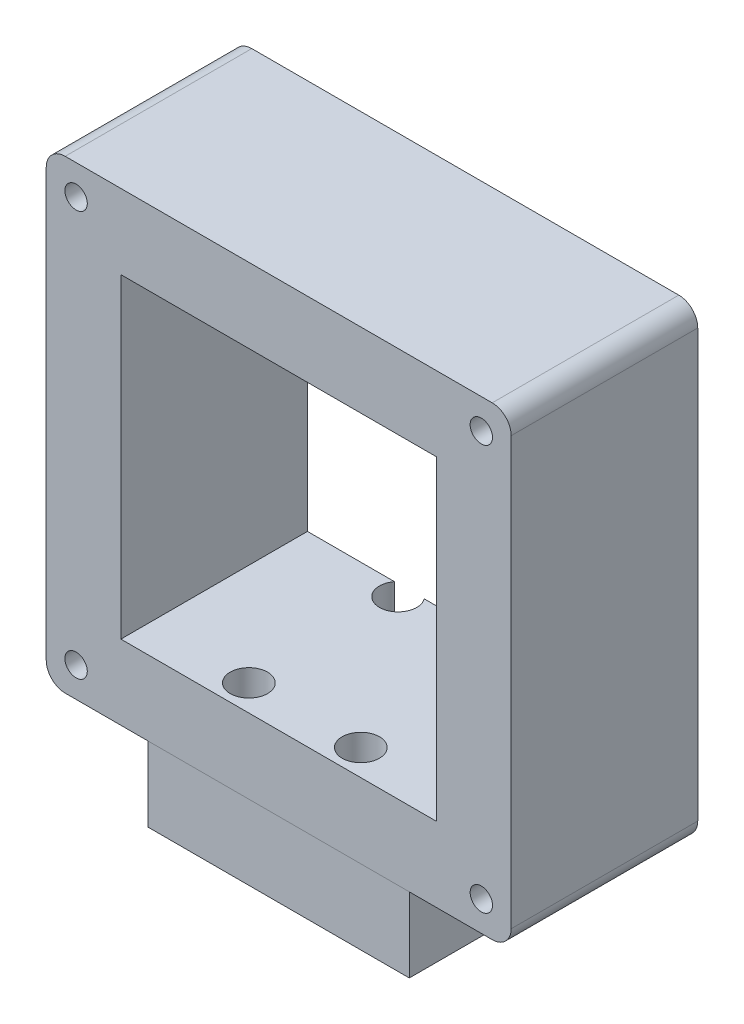
ISO-10303-21;
HEADER;
FILE_DESCRIPTION(('STEP AP214'),'2;1');
FILE_NAME('part.step','',(''),(''),'','','');
FILE_SCHEMA(('AUTOMOTIVE_DESIGN { 1 0 10303 214 1 1 1 1 }'));
ENDSEC;
DATA;
#1=APPLICATION_CONTEXT('core data for automotive mechanical design processes');
#2=APPLICATION_PROTOCOL_DEFINITION('international standard','automotive_design',2000,#1);
#3=PRODUCT_CONTEXT('',#1,'mechanical');
#4=PRODUCT('Part','Part','',(#3));
#5=PRODUCT_RELATED_PRODUCT_CATEGORY('part','',(#4));
#6=PRODUCT_DEFINITION_FORMATION('','',#4);
#7=PRODUCT_DEFINITION_CONTEXT('part definition',#1,'design');
#8=PRODUCT_DEFINITION('design','',#6,#7);
#9=PRODUCT_DEFINITION_SHAPE('','',#8);
#10=(LENGTH_UNIT() NAMED_UNIT(*) SI_UNIT(.MILLI.,.METRE.));
#11=(NAMED_UNIT(*) PLANE_ANGLE_UNIT() SI_UNIT($,.RADIAN.));
#12=(NAMED_UNIT(*) SI_UNIT($,.STERADIAN.) SOLID_ANGLE_UNIT());
#13=UNCERTAINTY_MEASURE_WITH_UNIT(LENGTH_MEASURE(1.E-05),#10,'distance_accuracy_value','');
#14=(GEOMETRIC_REPRESENTATION_CONTEXT(3) GLOBAL_UNCERTAINTY_ASSIGNED_CONTEXT((#13)) GLOBAL_UNIT_ASSIGNED_CONTEXT((#10,
#11,#12)) REPRESENTATION_CONTEXT('',''));
#15=CARTESIAN_POINT('',(0.,0.,0.));
#16=DIRECTION('',(0.,0.,1.));
#17=DIRECTION('',(1.,0.,0.));
#18=AXIS2_PLACEMENT_3D('',#15,#16,#17);
#19=CARTESIAN_POINT('',(0.,0.,-11.5));
#20=DIRECTION('',(0.,0.,-1.));
#21=DIRECTION('',(-1.,0.,0.));
#22=AXIS2_PLACEMENT_3D('',#19,#20,#21);
#23=PLANE('',#22);
#24=DIRECTION('',(0.,-1.,0.));
#25=VECTOR('',#24,1.);
#26=CARTESIAN_POINT('',(-5.50000003175,22.0710678118655,-11.5));
#27=LINE('',#26,#25);
#28=CARTESIAN_POINT('',(-5.50000003175,15.,-11.5));
#29=VERTEX_POINT('',#28);
#30=CARTESIAN_POINT('',(-5.50000003175,5.,-11.5));
#31=VERTEX_POINT('',#30);
#32=EDGE_CURVE('E341',#29,#31,#27,.T.);
#33=ORIENTED_EDGE('',*,*,#32,.F.);
#34=DIRECTION('',(1.,0.,0.));
#35=VECTOR('',#34,1.);
#36=CARTESIAN_POINT('',(-21.15,15.,-11.5));
#37=LINE('',#36,#35);
#38=CARTESIAN_POINT('',(5.50000003175,15.,-11.5));
#39=VERTEX_POINT('',#38);
#40=EDGE_CURVE('E198',#29,#39,#37,.T.);
#41=ORIENTED_EDGE('',*,*,#40,.T.);
#42=DIRECTION('',(0.,-1.,0.));
#43=VECTOR('',#42,1.);
#44=CARTESIAN_POINT('',(5.50000003175,22.0710678118655,-11.5));
#45=LINE('',#44,#43);
#46=CARTESIAN_POINT('',(5.50000003175,5.,-11.5));
#47=VERTEX_POINT('',#46);
#48=EDGE_CURVE('E175',#47,#39,#45,.F.);
#49=ORIENTED_EDGE('',*,*,#48,.F.);
#50=DIRECTION('',(1.,0.,0.));
#51=VECTOR('',#50,1.);
#52=CARTESIAN_POINT('',(-31.15,5.,-11.5));
#53=LINE('',#52,#51);
#54=EDGE_CURVE('E242',#31,#47,#53,.T.);
#55=ORIENTED_EDGE('',*,*,#54,.F.);
#56=EDGE_LOOP('',(#33,#41,#49,#55));
#57=FACE_BOUND('',#56,.T.);
#58=ADVANCED_FACE('F54',(#57),#23,.T.);
#59=CARTESIAN_POINT('',(31.15,5.,-11.5));
#60=DIRECTION('',(1.,0.,0.));
#61=DIRECTION('',(0.,0.,-1.));
#62=AXIS2_PLACEMENT_3D('',#59,#60,#61);
#63=PLANE('',#62);
#64=DIRECTION('',(0.,1.,0.));
#65=VECTOR('',#64,1.);
#66=CARTESIAN_POINT('',(31.15,5.,-11.5));
#67=LINE('',#66,#65);
#68=CARTESIAN_POINT('',(31.15,7.54,-11.5));
#69=VERTEX_POINT('',#68);
#70=CARTESIAN_POINT('',(31.15,64.76,-11.5));
#71=VERTEX_POINT('',#70);
#72=EDGE_CURVE('E226',#69,#71,#67,.T.);
#73=ORIENTED_EDGE('',*,*,#72,.T.);
#74=DIRECTION('',(0.,0.,1.));
#75=VECTOR('',#74,1.);
#76=CARTESIAN_POINT('',(31.15,64.76,-11.5));
#77=LINE('',#76,#75);
#78=CARTESIAN_POINT('',(31.15,64.76,13.5));
#79=VERTEX_POINT('',#78);
#80=EDGE_CURVE('E260',#71,#79,#77,.T.);
#81=ORIENTED_EDGE('',*,*,#80,.T.);
#82=DIRECTION('',(0.,1.,0.));
#83=VECTOR('',#82,1.);
#84=CARTESIAN_POINT('',(31.15,5.,13.5));
#85=LINE('',#84,#83);
#86=CARTESIAN_POINT('',(31.15,7.54,13.5));
#87=VERTEX_POINT('',#86);
#88=EDGE_CURVE('E243',#87,#79,#85,.T.);
#89=ORIENTED_EDGE('',*,*,#88,.F.);
#90=DIRECTION('',(0.,0.,1.));
#91=VECTOR('',#90,1.);
#92=CARTESIAN_POINT('',(31.15,7.54,-11.5));
#93=LINE('',#92,#91);
#94=EDGE_CURVE('E241',#87,#69,#93,.F.);
#95=ORIENTED_EDGE('',*,*,#94,.T.);
#96=EDGE_LOOP('',(#73,#81,#89,#95));
#97=FACE_BOUND('',#96,.T.);
#98=ADVANCED_FACE('F324',(#97),#63,.T.);
#99=CARTESIAN_POINT('',(-31.15,5.,-11.5));
#100=DIRECTION('',(0.,-1.,0.));
#101=DIRECTION('',(0.,0.,-1.));
#102=AXIS2_PLACEMENT_3D('',#99,#100,#101);
#103=PLANE('',#102);
#104=CARTESIAN_POINT('',(9.49999994025,5.,-11.5));
#105=VERTEX_POINT('',#104);
#106=CARTESIAN_POINT('',(28.61,5.,-11.5));
#107=VERTEX_POINT('',#106);
#108=EDGE_CURVE('E189',#105,#107,#53,.T.);
#109=ORIENTED_EDGE('',*,*,#108,.T.);
#110=DIRECTION('',(0.,0.,1.));
#111=VECTOR('',#110,1.);
#112=CARTESIAN_POINT('',(28.61,5.,-11.5));
#113=LINE('',#112,#111);
#114=CARTESIAN_POINT('',(28.61,5.,13.5));
#115=VERTEX_POINT('',#114);
#116=EDGE_CURVE('E296',#107,#115,#113,.T.);
#117=ORIENTED_EDGE('',*,*,#116,.T.);
#118=DIRECTION('',(1.,0.,0.));
#119=VECTOR('',#118,1.);
#120=CARTESIAN_POINT('',(-31.15,5.,13.5));
#121=LINE('',#120,#119);
#122=CARTESIAN_POINT('',(-28.61,5.,13.5));
#123=VERTEX_POINT('',#122);
#124=EDGE_CURVE('E231',#123,#115,#121,.T.);
#125=ORIENTED_EDGE('',*,*,#124,.F.);
#126=DIRECTION('',(0.,0.,1.));
#127=VECTOR('',#126,1.);
#128=CARTESIAN_POINT('',(-28.61,5.,-11.5));
#129=LINE('',#128,#127);
#130=CARTESIAN_POINT('',(-28.61,5.,-11.5));
#131=VERTEX_POINT('',#130);
#132=EDGE_CURVE('E293',#123,#131,#129,.F.);
#133=ORIENTED_EDGE('',*,*,#132,.T.);
#134=CARTESIAN_POINT('',(-9.49999994025,5.,-11.5));
#135=VERTEX_POINT('',#134);
#136=EDGE_CURVE('E238',#131,#135,#53,.T.);
#137=ORIENTED_EDGE('',*,*,#136,.T.);
#138=CARTESIAN_POINT('',(-7.499999986,5.,-9.999999939));
#139=DIRECTION('',(0.,-1.,0.));
#140=DIRECTION('',(0.,0.,-1.));
#141=AXIS2_PLACEMENT_3D('',#138,#139,#140);
#142=CIRCLE('',#141,2.5);
#143=EDGE_CURVE('E182',#31,#135,#142,.T.);
#144=ORIENTED_EDGE('',*,*,#143,.F.);
#145=ORIENTED_EDGE('',*,*,#54,.T.);
#146=CARTESIAN_POINT('',(7.499999986,5.,-9.999999939));
#147=DIRECTION('',(0.,-1.,0.));
#148=DIRECTION('',(0.,0.,-1.));
#149=AXIS2_PLACEMENT_3D('',#146,#147,#148);
#150=CIRCLE('',#149,2.5);
#151=EDGE_CURVE('E181',#105,#47,#150,.T.);
#152=ORIENTED_EDGE('',*,*,#151,.F.);
#153=EDGE_LOOP('',(#109,#117,#125,#133,#137,#144,#145,#152));
#154=FACE_BOUND('',#153,.T.);
#155=CARTESIAN_POINT('',(7.499999986,5.,9.999999939));
#156=DIRECTION('',(0.,-1.,0.));
#157=DIRECTION('',(0.,0.,-1.));
#158=AXIS2_PLACEMENT_3D('',#155,#156,#157);
#159=CIRCLE('',#158,2.5);
#160=CARTESIAN_POINT('',(7.499999986,5.,7.499999939));
#161=VERTEX_POINT('',#160);
#162=EDGE_CURVE('E387',#161,#161,#159,.T.);
#163=ORIENTED_EDGE('',*,*,#162,.F.);
#164=EDGE_LOOP('',(#163));
#165=FACE_BOUND('',#164,.T.);
#166=CARTESIAN_POINT('',(-7.499999986,5.,9.999999939));
#167=DIRECTION('',(0.,-1.,0.));
#168=DIRECTION('',(0.,0.,-1.));
#169=AXIS2_PLACEMENT_3D('',#166,#167,#168);
#170=CIRCLE('',#169,2.5);
#171=CARTESIAN_POINT('',(-7.499999986,5.,7.499999939));
#172=VERTEX_POINT('',#171);
#173=EDGE_CURVE('E347',#172,#172,#170,.T.);
#174=ORIENTED_EDGE('',*,*,#173,.F.);
#175=EDGE_LOOP('',(#174));
#176=FACE_BOUND('',#175,.T.);
#177=ADVANCED_FACE('F330',(#154,#165,#176),#103,.T.);
#178=CARTESIAN_POINT('',(-31.15,5.,-11.5));
#179=DIRECTION('',(-1.,0.,0.));
#180=DIRECTION('',(0.,0.,1.));
#181=AXIS2_PLACEMENT_3D('',#178,#179,#180);
#182=PLANE('',#181);
#183=DIRECTION('',(0.,-1.,0.));
#184=VECTOR('',#183,1.);
#185=CARTESIAN_POINT('',(-31.15,5.,13.5));
#186=LINE('',#185,#184);
#187=CARTESIAN_POINT('',(-31.15,64.76,13.5));
#188=VERTEX_POINT('',#187);
#189=CARTESIAN_POINT('',(-31.15,7.54,13.5));
#190=VERTEX_POINT('',#189);
#191=EDGE_CURVE('E251',#188,#190,#186,.T.);
#192=ORIENTED_EDGE('',*,*,#191,.F.);
#193=DIRECTION('',(0.,0.,1.));
#194=VECTOR('',#193,1.);
#195=CARTESIAN_POINT('',(-31.15,64.76,-11.5));
#196=LINE('',#195,#194);
#197=CARTESIAN_POINT('',(-31.15,64.76,-11.5));
#198=VERTEX_POINT('',#197);
#199=EDGE_CURVE('E12',#188,#198,#196,.F.);
#200=ORIENTED_EDGE('',*,*,#199,.T.);
#201=DIRECTION('',(0.,-1.,0.));
#202=VECTOR('',#201,1.);
#203=CARTESIAN_POINT('',(-31.15,5.,-11.5));
#204=LINE('',#203,#202);
#205=CARTESIAN_POINT('',(-31.15,7.54,-11.5));
#206=VERTEX_POINT('',#205);
#207=EDGE_CURVE('E235',#198,#206,#204,.T.);
#208=ORIENTED_EDGE('',*,*,#207,.T.);
#209=DIRECTION('',(0.,0.,1.));
#210=VECTOR('',#209,1.);
#211=CARTESIAN_POINT('',(-31.15,7.54,-11.5));
#212=LINE('',#211,#210);
#213=EDGE_CURVE('E63',#206,#190,#212,.T.);
#214=ORIENTED_EDGE('',*,*,#213,.T.);
#215=EDGE_LOOP('',(#192,#200,#208,#214));
#216=FACE_BOUND('',#215,.T.);
#217=ADVANCED_FACE('F304',(#216),#182,.T.);
#218=CARTESIAN_POINT('',(-31.15,67.3,-11.5));
#219=DIRECTION('',(0.,1.,0.));
#220=DIRECTION('',(0.,0.,1.));
#221=AXIS2_PLACEMENT_3D('',#218,#219,#220);
#222=PLANE('',#221);
#223=DIRECTION('',(-1.,0.,0.));
#224=VECTOR('',#223,1.);
#225=CARTESIAN_POINT('',(-31.15,67.3,13.5));
#226=LINE('',#225,#224);
#227=CARTESIAN_POINT('',(28.61,67.3,13.5));
#228=VERTEX_POINT('',#227);
#229=CARTESIAN_POINT('',(-28.61,67.3,13.5));
#230=VERTEX_POINT('',#229);
#231=EDGE_CURVE('E247',#228,#230,#226,.T.);
#232=ORIENTED_EDGE('',*,*,#231,.F.);
#233=DIRECTION('',(0.,0.,1.));
#234=VECTOR('',#233,1.);
#235=CARTESIAN_POINT('',(28.61,67.3,-11.5));
#236=LINE('',#235,#234);
#237=CARTESIAN_POINT('',(28.61,67.3,-11.5));
#238=VERTEX_POINT('',#237);
#239=EDGE_CURVE('E280',#228,#238,#236,.F.);
#240=ORIENTED_EDGE('',*,*,#239,.T.);
#241=DIRECTION('',(-1.,0.,0.));
#242=VECTOR('',#241,1.);
#243=CARTESIAN_POINT('',(-31.15,67.3,-11.5));
#244=LINE('',#243,#242);
#245=CARTESIAN_POINT('',(-28.61,67.3,-11.5));
#246=VERTEX_POINT('',#245);
#247=EDGE_CURVE('E230',#238,#246,#244,.T.);
#248=ORIENTED_EDGE('',*,*,#247,.T.);
#249=DIRECTION('',(0.,0.,1.));
#250=VECTOR('',#249,1.);
#251=CARTESIAN_POINT('',(-28.61,67.3,-11.5));
#252=LINE('',#251,#250);
#253=EDGE_CURVE('E276',#246,#230,#252,.T.);
#254=ORIENTED_EDGE('',*,*,#253,.T.);
#255=EDGE_LOOP('',(#232,#240,#248,#254));
#256=FACE_BOUND('',#255,.T.);
#257=ADVANCED_FACE('F316',(#256),#222,.T.);
#258=ORIENTED_EDGE('',*,*,#247,.F.);
#259=CARTESIAN_POINT('',(28.61,64.76,-11.5));
#260=DIRECTION('',(0.,0.,-1.));
#261=DIRECTION('',(-1.,0.,0.));
#262=AXIS2_PLACEMENT_3D('',#259,#260,#261);
#263=CIRCLE('',#262,2.54);
#264=EDGE_CURVE('E290',#238,#71,#263,.T.);
#265=ORIENTED_EDGE('',*,*,#264,.T.);
#266=ORIENTED_EDGE('',*,*,#72,.F.);
#267=CARTESIAN_POINT('',(28.61,7.54,-11.5));
#268=DIRECTION('',(0.,0.,-1.));
#269=DIRECTION('',(-1.,0.,0.));
#270=AXIS2_PLACEMENT_3D('',#267,#268,#269);
#271=CIRCLE('',#270,2.54);
#272=EDGE_CURVE('E70',#69,#107,#271,.T.);
#273=ORIENTED_EDGE('',*,*,#272,.T.);
#274=ORIENTED_EDGE('',*,*,#108,.F.);
#275=DIRECTION('',(0.,-1.,0.));
#276=VECTOR('',#275,1.);
#277=CARTESIAN_POINT('',(9.49999994025,22.0710678118655,-11.5));
#278=LINE('',#277,#276);
#279=CARTESIAN_POINT('',(9.49999994025,15.,-11.5));
#280=VERTEX_POINT('',#279);
#281=EDGE_CURVE('E172',#280,#105,#278,.T.);
#282=ORIENTED_EDGE('',*,*,#281,.F.);
#283=CARTESIAN_POINT('',(21.15,15.,-11.5));
#284=VERTEX_POINT('',#283);
#285=EDGE_CURVE('E187',#280,#284,#37,.T.);
#286=ORIENTED_EDGE('',*,*,#285,.T.);
#287=DIRECTION('',(0.,1.,0.));
#288=VECTOR('',#287,1.);
#289=CARTESIAN_POINT('',(21.15,15.,-11.5));
#290=LINE('',#289,#288);
#291=CARTESIAN_POINT('',(21.15,57.3,-11.5));
#292=VERTEX_POINT('',#291);
#293=EDGE_CURVE('E356',#284,#292,#290,.T.);
#294=ORIENTED_EDGE('',*,*,#293,.T.);
#295=DIRECTION('',(-1.,0.,0.));
#296=VECTOR('',#295,1.);
#297=CARTESIAN_POINT('',(-21.15,57.3,-11.5));
#298=LINE('',#297,#296);
#299=CARTESIAN_POINT('',(-21.15,57.3,-11.5));
#300=VERTEX_POINT('',#299);
#301=EDGE_CURVE('E205',#292,#300,#298,.T.);
#302=ORIENTED_EDGE('',*,*,#301,.T.);
#303=DIRECTION('',(0.,-1.,0.));
#304=VECTOR('',#303,1.);
#305=CARTESIAN_POINT('',(-21.15,15.,-11.5));
#306=LINE('',#305,#304);
#307=CARTESIAN_POINT('',(-21.15,15.,-11.5));
#308=VERTEX_POINT('',#307);
#309=EDGE_CURVE('E199',#300,#308,#306,.T.);
#310=ORIENTED_EDGE('',*,*,#309,.T.);
#311=CARTESIAN_POINT('',(-9.49999994025,15.,-11.5));
#312=VERTEX_POINT('',#311);
#313=EDGE_CURVE('E201',#308,#312,#37,.T.);
#314=ORIENTED_EDGE('',*,*,#313,.T.);
#315=DIRECTION('',(0.,-1.,0.));
#316=VECTOR('',#315,1.);
#317=CARTESIAN_POINT('',(-9.49999994025,22.0710678118655,-11.5));
#318=LINE('',#317,#316);
#319=EDGE_CURVE('E191',#135,#312,#318,.F.);
#320=ORIENTED_EDGE('',*,*,#319,.F.);
#321=ORIENTED_EDGE('',*,*,#136,.F.);
#322=CARTESIAN_POINT('',(-28.61,7.54,-11.5));
#323=DIRECTION('',(0.,0.,-1.));
#324=DIRECTION('',(-1.,0.,0.));
#325=AXIS2_PLACEMENT_3D('',#322,#323,#324);
#326=CIRCLE('',#325,2.54);
#327=EDGE_CURVE('E77',#131,#206,#326,.T.);
#328=ORIENTED_EDGE('',*,*,#327,.T.);
#329=ORIENTED_EDGE('',*,*,#207,.F.);
#330=CARTESIAN_POINT('',(-28.61,64.76,-11.5));
#331=DIRECTION('',(0.,0.,-1.));
#332=DIRECTION('',(-1.,0.,0.));
#333=AXIS2_PLACEMENT_3D('',#330,#331,#332);
#334=CIRCLE('',#333,2.54);
#335=EDGE_CURVE('E285',#198,#246,#334,.T.);
#336=ORIENTED_EDGE('',*,*,#335,.T.);
#337=EDGE_LOOP('',(#258,#265,#266,#273,#274,#282,#286,#294,#302,#310,#314,#320,#321,#328,#329,#336));
#338=FACE_BOUND('',#337,.T.);
#339=ADVANCED_FACE('F185',(#338),#23,.T.);
#340=CARTESIAN_POINT('',(0.,0.,13.5));
#341=DIRECTION('',(0.,0.,-1.));
#342=DIRECTION('',(-1.,0.,0.));
#343=AXIS2_PLACEMENT_3D('',#340,#341,#342);
#344=PLANE('',#343);
#345=CARTESIAN_POINT('',(-27.15,63.3,13.5));
#346=DIRECTION('',(0.,0.,1.));
#347=DIRECTION('',(1.,0.,0.));
#348=AXIS2_PLACEMENT_3D('',#345,#346,#347);
#349=CIRCLE('',#348,1.5);
#350=CARTESIAN_POINT('',(-25.65,63.3,13.5));
#351=VERTEX_POINT('',#350);
#352=EDGE_CURVE('E402',#351,#351,#349,.T.);
#353=ORIENTED_EDGE('',*,*,#352,.F.);
#354=EDGE_LOOP('',(#353));
#355=FACE_BOUND('',#354,.T.);
#356=CARTESIAN_POINT('',(27.15,9.00000000000002,13.5));
#357=DIRECTION('',(0.,0.,1.));
#358=DIRECTION('',(1.,0.,0.));
#359=AXIS2_PLACEMENT_3D('',#356,#357,#358);
#360=CIRCLE('',#359,1.5);
#361=CARTESIAN_POINT('',(28.65,9.00000000000002,13.5));
#362=VERTEX_POINT('',#361);
#363=EDGE_CURVE('E408',#362,#362,#360,.T.);
#364=ORIENTED_EDGE('',*,*,#363,.F.);
#365=EDGE_LOOP('',(#364));
#366=FACE_BOUND('',#365,.T.);
#367=CARTESIAN_POINT('',(-27.15,9.00000000000002,13.5));
#368=DIRECTION('',(0.,0.,1.));
#369=DIRECTION('',(1.,0.,0.));
#370=AXIS2_PLACEMENT_3D('',#367,#368,#369);
#371=CIRCLE('',#370,1.5);
#372=CARTESIAN_POINT('',(-25.65,9.00000000000002,13.5));
#373=VERTEX_POINT('',#372);
#374=EDGE_CURVE('E409',#373,#373,#371,.T.);
#375=ORIENTED_EDGE('',*,*,#374,.F.);
#376=EDGE_LOOP('',(#375));
#377=FACE_BOUND('',#376,.T.);
#378=CARTESIAN_POINT('',(27.15,63.3,13.5));
#379=DIRECTION('',(0.,0.,1.));
#380=DIRECTION('',(1.,0.,0.));
#381=AXIS2_PLACEMENT_3D('',#378,#379,#380);
#382=CIRCLE('',#381,1.5);
#383=CARTESIAN_POINT('',(28.65,63.3,13.5));
#384=VERTEX_POINT('',#383);
#385=EDGE_CURVE('E382',#384,#384,#382,.T.);
#386=ORIENTED_EDGE('',*,*,#385,.F.);
#387=EDGE_LOOP('',(#386));
#388=FACE_BOUND('',#387,.T.);
#389=DIRECTION('',(-1.,0.,0.));
#390=VECTOR('',#389,1.);
#391=CARTESIAN_POINT('',(-21.15,57.3,13.5));
#392=LINE('',#391,#390);
#393=CARTESIAN_POINT('',(21.15,57.3,13.5));
#394=VERTEX_POINT('',#393);
#395=CARTESIAN_POINT('',(-21.15,57.3,13.5));
#396=VERTEX_POINT('',#395);
#397=EDGE_CURVE('E364',#394,#396,#392,.T.);
#398=ORIENTED_EDGE('',*,*,#397,.F.);
#399=DIRECTION('',(0.,1.,0.));
#400=VECTOR('',#399,1.);
#401=CARTESIAN_POINT('',(21.15,15.,13.5));
#402=LINE('',#401,#400);
#403=CARTESIAN_POINT('',(21.15,15.,13.5));
#404=VERTEX_POINT('',#403);
#405=EDGE_CURVE('E355',#404,#394,#402,.T.);
#406=ORIENTED_EDGE('',*,*,#405,.F.);
#407=DIRECTION('',(1.,0.,0.));
#408=VECTOR('',#407,1.);
#409=CARTESIAN_POINT('',(-21.15,15.,13.5));
#410=LINE('',#409,#408);
#411=CARTESIAN_POINT('',(-21.15,15.,13.5));
#412=VERTEX_POINT('',#411);
#413=EDGE_CURVE('E359',#412,#404,#410,.T.);
#414=ORIENTED_EDGE('',*,*,#413,.F.);
#415=DIRECTION('',(0.,-1.,0.));
#416=VECTOR('',#415,1.);
#417=CARTESIAN_POINT('',(-21.15,15.,13.5));
#418=LINE('',#417,#416);
#419=EDGE_CURVE('E369',#396,#412,#418,.T.);
#420=ORIENTED_EDGE('',*,*,#419,.F.);
#421=EDGE_LOOP('',(#398,#406,#414,#420));
#422=FACE_BOUND('',#421,.T.);
#423=ORIENTED_EDGE('',*,*,#88,.T.);
#424=CARTESIAN_POINT('',(28.61,64.76,13.5));
#425=DIRECTION('',(0.,0.,-1.));
#426=DIRECTION('',(-1.,0.,0.));
#427=AXIS2_PLACEMENT_3D('',#424,#425,#426);
#428=CIRCLE('',#427,2.54);
#429=EDGE_CURVE('E273',#79,#228,#428,.F.);
#430=ORIENTED_EDGE('',*,*,#429,.T.);
#431=ORIENTED_EDGE('',*,*,#231,.T.);
#432=CARTESIAN_POINT('',(-28.61,64.76,13.5));
#433=DIRECTION('',(0.,0.,-1.));
#434=DIRECTION('',(-1.,0.,0.));
#435=AXIS2_PLACEMENT_3D('',#432,#433,#434);
#436=CIRCLE('',#435,2.54);
#437=EDGE_CURVE('E267',#230,#188,#436,.F.);
#438=ORIENTED_EDGE('',*,*,#437,.T.);
#439=ORIENTED_EDGE('',*,*,#191,.T.);
#440=CARTESIAN_POINT('',(-28.61,7.54,13.5));
#441=DIRECTION('',(0.,0.,-1.));
#442=DIRECTION('',(-1.,0.,0.));
#443=AXIS2_PLACEMENT_3D('',#440,#441,#442);
#444=CIRCLE('',#443,2.54);
#445=EDGE_CURVE('E264',#190,#123,#444,.F.);
#446=ORIENTED_EDGE('',*,*,#445,.T.);
#447=ORIENTED_EDGE('',*,*,#124,.T.);
#448=CARTESIAN_POINT('',(28.61,7.54,13.5));
#449=DIRECTION('',(0.,0.,-1.));
#450=DIRECTION('',(-1.,0.,0.));
#451=AXIS2_PLACEMENT_3D('',#448,#449,#450);
#452=CIRCLE('',#451,2.54);
#453=EDGE_CURVE('E270',#115,#87,#452,.F.);
#454=ORIENTED_EDGE('',*,*,#453,.T.);
#455=EDGE_LOOP('',(#423,#430,#431,#438,#439,#446,#447,#454));
#456=FACE_BOUND('',#455,.T.);
#457=ADVANCED_FACE('F308',(#355,#366,#377,#388,#422,#456),#344,.F.);
#458=CARTESIAN_POINT('',(21.15,15.,-11.5));
#459=DIRECTION('',(1.,0.,0.));
#460=DIRECTION('',(0.,0.,-1.));
#461=AXIS2_PLACEMENT_3D('',#458,#459,#460);
#462=PLANE('',#461);
#463=ORIENTED_EDGE('',*,*,#405,.T.);
#464=DIRECTION('',(0.,0.,1.));
#465=VECTOR('',#464,1.);
#466=CARTESIAN_POINT('',(21.15,57.3,-11.5));
#467=LINE('',#466,#465);
#468=EDGE_CURVE('E210',#292,#394,#467,.T.);
#469=ORIENTED_EDGE('',*,*,#468,.F.);
#470=ORIENTED_EDGE('',*,*,#293,.F.);
#471=DIRECTION('',(0.,0.,1.));
#472=VECTOR('',#471,1.);
#473=CARTESIAN_POINT('',(21.15,15.,-11.5));
#474=LINE('',#473,#472);
#475=EDGE_CURVE('E195',#284,#404,#474,.T.);
#476=ORIENTED_EDGE('',*,*,#475,.T.);
#477=EDGE_LOOP('',(#463,#469,#470,#476));
#478=FACE_BOUND('',#477,.T.);
#479=ADVANCED_FACE('F432',(#478),#462,.F.);
#480=CARTESIAN_POINT('',(-21.15,15.,-11.5));
#481=DIRECTION('',(0.,-1.,0.));
#482=DIRECTION('',(0.,0.,-1.));
#483=AXIS2_PLACEMENT_3D('',#480,#481,#482);
#484=PLANE('',#483);
#485=CARTESIAN_POINT('',(7.499999986,15.,9.999999939));
#486=DIRECTION('',(0.,-1.,0.));
#487=DIRECTION('',(0.,0.,-1.));
#488=AXIS2_PLACEMENT_3D('',#485,#486,#487);
#489=CIRCLE('',#488,2.5);
#490=CARTESIAN_POINT('',(7.499999986,15.,7.499999939));
#491=VERTEX_POINT('',#490);
#492=EDGE_CURVE('E392',#491,#491,#489,.F.);
#493=ORIENTED_EDGE('',*,*,#492,.F.);
#494=EDGE_LOOP('',(#493));
#495=FACE_BOUND('',#494,.T.);
#496=CARTESIAN_POINT('',(-7.499999986,15.,9.999999939));
#497=DIRECTION('',(0.,-1.,0.));
#498=DIRECTION('',(0.,0.,-1.));
#499=AXIS2_PLACEMENT_3D('',#496,#497,#498);
#500=CIRCLE('',#499,2.5);
#501=CARTESIAN_POINT('',(-7.499999986,15.,7.499999939));
#502=VERTEX_POINT('',#501);
#503=EDGE_CURVE('E343',#502,#502,#500,.F.);
#504=ORIENTED_EDGE('',*,*,#503,.F.);
#505=EDGE_LOOP('',(#504));
#506=FACE_BOUND('',#505,.T.);
#507=ORIENTED_EDGE('',*,*,#40,.F.);
#508=CARTESIAN_POINT('',(-7.499999986,15.,-9.999999939));
#509=DIRECTION('',(0.,-1.,0.));
#510=DIRECTION('',(0.,0.,-1.));
#511=AXIS2_PLACEMENT_3D('',#508,#509,#510);
#512=CIRCLE('',#511,2.5);
#513=EDGE_CURVE('E373',#312,#29,#512,.F.);
#514=ORIENTED_EDGE('',*,*,#513,.F.);
#515=ORIENTED_EDGE('',*,*,#313,.F.);
#516=DIRECTION('',(0.,0.,1.));
#517=VECTOR('',#516,1.);
#518=CARTESIAN_POINT('',(-21.15,15.,-11.5));
#519=LINE('',#518,#517);
#520=EDGE_CURVE('E222',#308,#412,#519,.T.);
#521=ORIENTED_EDGE('',*,*,#520,.T.);
#522=ORIENTED_EDGE('',*,*,#413,.T.);
#523=ORIENTED_EDGE('',*,*,#475,.F.);
#524=ORIENTED_EDGE('',*,*,#285,.F.);
#525=CARTESIAN_POINT('',(7.499999986,15.,-9.999999939));
#526=DIRECTION('',(0.,-1.,0.));
#527=DIRECTION('',(0.,0.,-1.));
#528=AXIS2_PLACEMENT_3D('',#525,#526,#527);
#529=CIRCLE('',#528,2.5);
#530=EDGE_CURVE('E169',#39,#280,#529,.F.);
#531=ORIENTED_EDGE('',*,*,#530,.F.);
#532=EDGE_LOOP('',(#507,#514,#515,#521,#522,#523,#524,#531));
#533=FACE_BOUND('',#532,.T.);
#534=ADVANCED_FACE('F193',(#495,#506,#533),#484,.F.);
#535=CARTESIAN_POINT('',(-21.15,15.,-11.5));
#536=DIRECTION('',(-1.,0.,0.));
#537=DIRECTION('',(0.,-1.,0.));
#538=AXIS2_PLACEMENT_3D('',#535,#536,#537);
#539=PLANE('',#538);
#540=ORIENTED_EDGE('',*,*,#419,.T.);
#541=ORIENTED_EDGE('',*,*,#520,.F.);
#542=ORIENTED_EDGE('',*,*,#309,.F.);
#543=DIRECTION('',(0.,0.,1.));
#544=VECTOR('',#543,1.);
#545=CARTESIAN_POINT('',(-21.15,57.3,-11.5));
#546=LINE('',#545,#544);
#547=EDGE_CURVE('E215',#300,#396,#546,.T.);
#548=ORIENTED_EDGE('',*,*,#547,.T.);
#549=EDGE_LOOP('',(#540,#541,#542,#548));
#550=FACE_BOUND('',#549,.T.);
#551=ADVANCED_FACE('F368',(#550),#539,.F.);
#552=CARTESIAN_POINT('',(-21.15,57.3,-11.5));
#553=DIRECTION('',(0.,1.,0.));
#554=DIRECTION('',(-1.,0.,0.));
#555=AXIS2_PLACEMENT_3D('',#552,#553,#554);
#556=PLANE('',#555);
#557=ORIENTED_EDGE('',*,*,#397,.T.);
#558=ORIENTED_EDGE('',*,*,#547,.F.);
#559=ORIENTED_EDGE('',*,*,#301,.F.);
#560=ORIENTED_EDGE('',*,*,#468,.T.);
#561=EDGE_LOOP('',(#557,#558,#559,#560));
#562=FACE_BOUND('',#561,.T.);
#563=ADVANCED_FACE('F363',(#562),#556,.F.);
#564=CARTESIAN_POINT('',(-7.499999986,22.0710678118655,9.999999939));
#565=DIRECTION('',(0.,-1.,0.));
#566=DIRECTION('',(0.,0.,-1.));
#567=AXIS2_PLACEMENT_3D('',#564,#565,#566);
#568=CYLINDRICAL_SURFACE('',#567,2.5);
#569=ORIENTED_EDGE('',*,*,#503,.T.);
#570=EDGE_LOOP('',(#569));
#571=FACE_BOUND('',#570,.T.);
#572=ORIENTED_EDGE('',*,*,#173,.T.);
#573=EDGE_LOOP('',(#572));
#574=FACE_BOUND('',#573,.T.);
#575=ADVANCED_FACE('F500',(#571,#574),#568,.F.);
#576=CARTESIAN_POINT('',(7.499999986,22.0710678118655,9.999999939));
#577=DIRECTION('',(0.,-1.,0.));
#578=DIRECTION('',(0.,0.,-1.));
#579=AXIS2_PLACEMENT_3D('',#576,#577,#578);
#580=CYLINDRICAL_SURFACE('',#579,2.5);
#581=ORIENTED_EDGE('',*,*,#492,.T.);
#582=EDGE_LOOP('',(#581));
#583=FACE_BOUND('',#582,.T.);
#584=ORIENTED_EDGE('',*,*,#162,.T.);
#585=EDGE_LOOP('',(#584));
#586=FACE_BOUND('',#585,.T.);
#587=ADVANCED_FACE('F496',(#583,#586),#580,.F.);
#588=CARTESIAN_POINT('',(7.499999986,22.0710678118655,-9.999999939));
#589=DIRECTION('',(0.,-1.,0.));
#590=DIRECTION('',(0.,0.,-1.));
#591=AXIS2_PLACEMENT_3D('',#588,#589,#590);
#592=CYLINDRICAL_SURFACE('',#591,2.5);
#593=ORIENTED_EDGE('',*,*,#281,.T.);
#594=ORIENTED_EDGE('',*,*,#151,.T.);
#595=ORIENTED_EDGE('',*,*,#48,.T.);
#596=ORIENTED_EDGE('',*,*,#530,.T.);
#597=EDGE_LOOP('',(#593,#594,#595,#596));
#598=FACE_BOUND('',#597,.T.);
#599=ADVANCED_FACE('F171',(#598),#592,.F.);
#600=CARTESIAN_POINT('',(-7.499999986,22.0710678118655,-9.999999939));
#601=DIRECTION('',(0.,-1.,0.));
#602=DIRECTION('',(0.,0.,-1.));
#603=AXIS2_PLACEMENT_3D('',#600,#601,#602);
#604=CYLINDRICAL_SURFACE('',#603,2.5);
#605=ORIENTED_EDGE('',*,*,#32,.T.);
#606=ORIENTED_EDGE('',*,*,#143,.T.);
#607=ORIENTED_EDGE('',*,*,#319,.T.);
#608=ORIENTED_EDGE('',*,*,#513,.T.);
#609=EDGE_LOOP('',(#605,#606,#607,#608));
#610=FACE_BOUND('',#609,.T.);
#611=ADVANCED_FACE('F485',(#610),#604,.F.);
#612=CARTESIAN_POINT('',(27.15,63.3,8.5));
#613=DIRECTION('',(0.,0.,1.));
#614=DIRECTION('',(1.,0.,0.));
#615=AXIS2_PLACEMENT_3D('',#612,#613,#614);
#616=CYLINDRICAL_SURFACE('',#615,1.5);
#617=CARTESIAN_POINT('',(27.15,63.3,8.5));
#618=DIRECTION('',(0.,0.,1.));
#619=DIRECTION('',(1.,0.,0.));
#620=AXIS2_PLACEMENT_3D('',#617,#618,#619);
#621=CIRCLE('',#620,1.5);
#622=CARTESIAN_POINT('',(28.65,63.3,8.5));
#623=VERTEX_POINT('',#622);
#624=EDGE_CURVE('E376',#623,#623,#621,.T.);
#625=ORIENTED_EDGE('',*,*,#624,.F.);
#626=EDGE_LOOP('',(#625));
#627=FACE_BOUND('',#626,.T.);
#628=ORIENTED_EDGE('',*,*,#385,.T.);
#629=EDGE_LOOP('',(#628));
#630=FACE_BOUND('',#629,.T.);
#631=ADVANCED_FACE('F487',(#627,#630),#616,.F.);
#632=CARTESIAN_POINT('',(27.15,63.3,8.5));
#633=DIRECTION('',(0.,0.,1.));
#634=DIRECTION('',(1.,0.,0.));
#635=AXIS2_PLACEMENT_3D('',#632,#633,#634);
#636=PLANE('',#635);
#637=ORIENTED_EDGE('',*,*,#624,.T.);
#638=EDGE_LOOP('',(#637));
#639=FACE_BOUND('',#638,.T.);
#640=ADVANCED_FACE('F493',(#639),#636,.T.);
#641=CARTESIAN_POINT('',(-27.15,9.00000000000002,8.5));
#642=DIRECTION('',(0.,0.,1.));
#643=DIRECTION('',(1.,0.,0.));
#644=AXIS2_PLACEMENT_3D('',#641,#642,#643);
#645=CYLINDRICAL_SURFACE('',#644,1.5);
#646=CARTESIAN_POINT('',(-27.15,9.00000000000002,8.5));
#647=DIRECTION('',(0.,0.,1.));
#648=DIRECTION('',(1.,0.,0.));
#649=AXIS2_PLACEMENT_3D('',#646,#647,#648);
#650=CIRCLE('',#649,1.5);
#651=CARTESIAN_POINT('',(-25.65,9.00000000000002,8.5));
#652=VERTEX_POINT('',#651);
#653=EDGE_CURVE('E420',#652,#652,#650,.T.);
#654=ORIENTED_EDGE('',*,*,#653,.F.);
#655=EDGE_LOOP('',(#654));
#656=FACE_BOUND('',#655,.T.);
#657=ORIENTED_EDGE('',*,*,#374,.T.);
#658=EDGE_LOOP('',(#657));
#659=FACE_BOUND('',#658,.T.);
#660=ADVANCED_FACE('F428',(#656,#659),#645,.F.);
#661=CARTESIAN_POINT('',(-27.15,9.00000000000002,8.5));
#662=DIRECTION('',(0.,0.,1.));
#663=DIRECTION('',(1.,0.,0.));
#664=AXIS2_PLACEMENT_3D('',#661,#662,#663);
#665=PLANE('',#664);
#666=ORIENTED_EDGE('',*,*,#653,.T.);
#667=EDGE_LOOP('',(#666));
#668=FACE_BOUND('',#667,.T.);
#669=ADVANCED_FACE('F591',(#668),#665,.T.);
#670=CARTESIAN_POINT('',(27.15,9.00000000000002,8.5));
#671=DIRECTION('',(0.,0.,1.));
#672=DIRECTION('',(1.,0.,0.));
#673=AXIS2_PLACEMENT_3D('',#670,#671,#672);
#674=CYLINDRICAL_SURFACE('',#673,1.5);
#675=CARTESIAN_POINT('',(27.15,9.00000000000002,8.5));
#676=DIRECTION('',(0.,0.,1.));
#677=DIRECTION('',(1.,0.,0.));
#678=AXIS2_PLACEMENT_3D('',#675,#676,#677);
#679=CIRCLE('',#678,1.5);
#680=CARTESIAN_POINT('',(28.65,9.00000000000002,8.5));
#681=VERTEX_POINT('',#680);
#682=EDGE_CURVE('E404',#681,#681,#679,.T.);
#683=ORIENTED_EDGE('',*,*,#682,.F.);
#684=EDGE_LOOP('',(#683));
#685=FACE_BOUND('',#684,.T.);
#686=ORIENTED_EDGE('',*,*,#363,.T.);
#687=EDGE_LOOP('',(#686));
#688=FACE_BOUND('',#687,.T.);
#689=ADVANCED_FACE('F582',(#685,#688),#674,.F.);
#690=CARTESIAN_POINT('',(27.15,9.00000000000002,8.5));
#691=DIRECTION('',(0.,0.,1.));
#692=DIRECTION('',(1.,0.,0.));
#693=AXIS2_PLACEMENT_3D('',#690,#691,#692);
#694=PLANE('',#693);
#695=ORIENTED_EDGE('',*,*,#682,.T.);
#696=EDGE_LOOP('',(#695));
#697=FACE_BOUND('',#696,.T.);
#698=ADVANCED_FACE('F573',(#697),#694,.T.);
#699=CARTESIAN_POINT('',(-27.15,63.3,8.5));
#700=DIRECTION('',(0.,0.,1.));
#701=DIRECTION('',(1.,0.,0.));
#702=AXIS2_PLACEMENT_3D('',#699,#700,#701);
#703=CYLINDRICAL_SURFACE('',#702,1.5);
#704=CARTESIAN_POINT('',(-27.15,63.3,8.5));
#705=DIRECTION('',(0.,0.,1.));
#706=DIRECTION('',(1.,0.,0.));
#707=AXIS2_PLACEMENT_3D('',#704,#705,#706);
#708=CIRCLE('',#707,1.5);
#709=CARTESIAN_POINT('',(-25.65,63.3,8.5));
#710=VERTEX_POINT('',#709);
#711=EDGE_CURVE('E413',#710,#710,#708,.T.);
#712=ORIENTED_EDGE('',*,*,#711,.F.);
#713=EDGE_LOOP('',(#712));
#714=FACE_BOUND('',#713,.T.);
#715=ORIENTED_EDGE('',*,*,#352,.T.);
#716=EDGE_LOOP('',(#715));
#717=FACE_BOUND('',#716,.T.);
#718=ADVANCED_FACE('F563',(#714,#717),#703,.F.);
#719=CARTESIAN_POINT('',(-27.15,63.3,8.5));
#720=DIRECTION('',(0.,0.,1.));
#721=DIRECTION('',(1.,0.,0.));
#722=AXIS2_PLACEMENT_3D('',#719,#720,#721);
#723=PLANE('',#722);
#724=ORIENTED_EDGE('',*,*,#711,.T.);
#725=EDGE_LOOP('',(#724));
#726=FACE_BOUND('',#725,.T.);
#727=ADVANCED_FACE('F477',(#726),#723,.T.);
#728=CARTESIAN_POINT('',(28.61,64.76,-11.5));
#729=DIRECTION('',(0.,0.,1.));
#730=DIRECTION('',(1.,0.,0.));
#731=AXIS2_PLACEMENT_3D('',#728,#729,#730);
#732=CYLINDRICAL_SURFACE('',#731,2.54);
#733=ORIENTED_EDGE('',*,*,#264,.F.);
#734=ORIENTED_EDGE('',*,*,#239,.F.);
#735=ORIENTED_EDGE('',*,*,#429,.F.);
#736=ORIENTED_EDGE('',*,*,#80,.F.);
#737=EDGE_LOOP('',(#733,#734,#735,#736));
#738=FACE_BOUND('',#737,.T.);
#739=ADVANCED_FACE('F321',(#738),#732,.T.);
#740=CARTESIAN_POINT('',(28.61,7.54,-11.5));
#741=DIRECTION('',(0.,0.,1.));
#742=DIRECTION('',(1.,0.,0.));
#743=AXIS2_PLACEMENT_3D('',#740,#741,#742);
#744=CYLINDRICAL_SURFACE('',#743,2.54);
#745=ORIENTED_EDGE('',*,*,#272,.F.);
#746=ORIENTED_EDGE('',*,*,#94,.F.);
#747=ORIENTED_EDGE('',*,*,#453,.F.);
#748=ORIENTED_EDGE('',*,*,#116,.F.);
#749=EDGE_LOOP('',(#745,#746,#747,#748));
#750=FACE_BOUND('',#749,.T.);
#751=ADVANCED_FACE('F328',(#750),#744,.T.);
#752=CARTESIAN_POINT('',(-28.61,64.76,-11.5));
#753=DIRECTION('',(0.,0.,1.));
#754=DIRECTION('',(1.,0.,0.));
#755=AXIS2_PLACEMENT_3D('',#752,#753,#754);
#756=CYLINDRICAL_SURFACE('',#755,2.54);
#757=ORIENTED_EDGE('',*,*,#335,.F.);
#758=ORIENTED_EDGE('',*,*,#199,.F.);
#759=ORIENTED_EDGE('',*,*,#437,.F.);
#760=ORIENTED_EDGE('',*,*,#253,.F.);
#761=EDGE_LOOP('',(#757,#758,#759,#760));
#762=FACE_BOUND('',#761,.T.);
#763=ADVANCED_FACE('F314',(#762),#756,.T.);
#764=CARTESIAN_POINT('',(-28.61,7.54,-11.5));
#765=DIRECTION('',(0.,0.,1.));
#766=DIRECTION('',(1.,0.,0.));
#767=AXIS2_PLACEMENT_3D('',#764,#765,#766);
#768=CYLINDRICAL_SURFACE('',#767,2.54);
#769=ORIENTED_EDGE('',*,*,#327,.F.);
#770=ORIENTED_EDGE('',*,*,#132,.F.);
#771=ORIENTED_EDGE('',*,*,#445,.F.);
#772=ORIENTED_EDGE('',*,*,#213,.F.);
#773=EDGE_LOOP('',(#769,#770,#771,#772));
#774=FACE_BOUND('',#773,.T.);
#775=ADVANCED_FACE('F56',(#774),#768,.T.);
#776=CLOSED_SHELL('',(#58,#98,#177,#217,#257,#339,#457,#479,#534,#551,#563,#575,#587,#599,#611,
#631,#640,#660,#669,#689,#698,#718,#727,#739,#751,#763,#775));
#777=MANIFOLD_SOLID_BREP('B2',#776);
#778=CARTESIAN_POINT('',(0.,5.,0.));
#779=DIRECTION('',(0.,-1.,0.));
#780=DIRECTION('',(0.,0.,-1.));
#781=AXIS2_PLACEMENT_3D('',#778,#779,#780);
#782=PLANE('',#781);
#783=DIRECTION('',(0.,0.,-1.));
#784=VECTOR('',#783,1.);
#785=CARTESIAN_POINT('',(17.5,5.,13.5));
#786=LINE('',#785,#784);
#787=CARTESIAN_POINT('',(17.5,5.,13.5));
#788=VERTEX_POINT('',#787);
#789=CARTESIAN_POINT('',(17.5,5.,-13.5));
#790=VERTEX_POINT('',#789);
#791=EDGE_CURVE('E749',#788,#790,#786,.T.);
#792=ORIENTED_EDGE('',*,*,#791,.T.);
#793=DIRECTION('',(-1.,0.,0.));
#794=VECTOR('',#793,1.);
#795=CARTESIAN_POINT('',(-17.5,5.,-13.5));
#796=LINE('',#795,#794);
#797=CARTESIAN_POINT('',(-17.5,5.,-13.5));
#798=VERTEX_POINT('',#797);
#799=EDGE_CURVE('E744',#790,#798,#796,.T.);
#800=ORIENTED_EDGE('',*,*,#799,.T.);
#801=DIRECTION('',(0.,0.,1.));
#802=VECTOR('',#801,1.);
#803=CARTESIAN_POINT('',(-17.5,5.,13.5));
#804=LINE('',#803,#802);
#805=CARTESIAN_POINT('',(-17.5,5.,13.5));
#806=VERTEX_POINT('',#805);
#807=EDGE_CURVE('E747',#798,#806,#804,.T.);
#808=ORIENTED_EDGE('',*,*,#807,.T.);
#809=DIRECTION('',(1.,0.,0.));
#810=VECTOR('',#809,1.);
#811=CARTESIAN_POINT('',(-17.5,5.,13.5));
#812=LINE('',#811,#810);
#813=EDGE_CURVE('E714',#806,#788,#812,.T.);
#814=ORIENTED_EDGE('',*,*,#813,.T.);
#815=EDGE_LOOP('',(#792,#800,#808,#814));
#816=FACE_BOUND('',#815,.T.);
#817=CARTESIAN_POINT('',(-7.499999986,5.,-9.999999939));
#818=DIRECTION('',(0.,1.,0.));
#819=DIRECTION('',(0.,0.,1.));
#820=AXIS2_PLACEMENT_3D('',#817,#818,#819);
#821=CIRCLE('',#820,1.500000048);
#822=CARTESIAN_POINT('',(-7.499999986,5.,-8.499999891));
#823=VERTEX_POINT('',#822);
#824=EDGE_CURVE('E764',#823,#823,#821,.T.);
#825=ORIENTED_EDGE('',*,*,#824,.F.);
#826=EDGE_LOOP('',(#825));
#827=FACE_BOUND('',#826,.T.);
#828=CARTESIAN_POINT('',(7.499999986,5.,-9.999999939));
#829=DIRECTION('',(0.,1.,0.));
#830=DIRECTION('',(0.,0.,1.));
#831=AXIS2_PLACEMENT_3D('',#828,#829,#830);
#832=CIRCLE('',#831,1.500000048);
#833=CARTESIAN_POINT('',(7.499999986,5.,-8.499999891));
#834=VERTEX_POINT('',#833);
#835=EDGE_CURVE('E779',#834,#834,#832,.T.);
#836=ORIENTED_EDGE('',*,*,#835,.F.);
#837=EDGE_LOOP('',(#836));
#838=FACE_BOUND('',#837,.T.);
#839=CARTESIAN_POINT('',(7.499999986,5.,9.999999939));
#840=DIRECTION('',(0.,1.,0.));
#841=DIRECTION('',(0.,0.,1.));
#842=AXIS2_PLACEMENT_3D('',#839,#840,#841);
#843=CIRCLE('',#842,1.500000048);
#844=CARTESIAN_POINT('',(7.499999986,5.,11.499999987));
#845=VERTEX_POINT('',#844);
#846=EDGE_CURVE('E785',#845,#845,#843,.T.);
#847=ORIENTED_EDGE('',*,*,#846,.F.);
#848=EDGE_LOOP('',(#847));
#849=FACE_BOUND('',#848,.T.);
#850=CARTESIAN_POINT('',(-7.499999986,5.,9.999999939));
#851=DIRECTION('',(0.,1.,0.));
#852=DIRECTION('',(0.,0.,1.));
#853=AXIS2_PLACEMENT_3D('',#850,#851,#852);
#854=CIRCLE('',#853,1.500000048);
#855=CARTESIAN_POINT('',(-7.499999986,5.,11.499999987));
#856=VERTEX_POINT('',#855);
#857=EDGE_CURVE('E791',#856,#856,#854,.T.);
#858=ORIENTED_EDGE('',*,*,#857,.F.);
#859=EDGE_LOOP('',(#858));
#860=FACE_BOUND('',#859,.T.);
#861=ADVANCED_FACE('F697',(#816,#827,#838,#849,#860),#782,.F.);
#862=CARTESIAN_POINT('',(0.,-5.,0.));
#863=DIRECTION('',(0.,-1.,0.));
#864=DIRECTION('',(0.,0.,-1.));
#865=AXIS2_PLACEMENT_3D('',#862,#863,#864);
#866=PLANE('',#865);
#867=CARTESIAN_POINT('',(7.499999986,-5.,9.999999939));
#868=DIRECTION('',(0.,1.,0.));
#869=DIRECTION('',(0.,0.,1.));
#870=AXIS2_PLACEMENT_3D('',#867,#868,#869);
#871=CIRCLE('',#870,1.500000048);
#872=CARTESIAN_POINT('',(7.499999986,-5.,11.499999987));
#873=VERTEX_POINT('',#872);
#874=EDGE_CURVE('E788',#873,#873,#871,.T.);
#875=ORIENTED_EDGE('',*,*,#874,.T.);
#876=EDGE_LOOP('',(#875));
#877=FACE_BOUND('',#876,.T.);
#878=CARTESIAN_POINT('',(-7.499999986,-5.,-9.999999939));
#879=DIRECTION('',(0.,1.,0.));
#880=DIRECTION('',(0.,0.,1.));
#881=AXIS2_PLACEMENT_3D('',#878,#879,#880);
#882=CIRCLE('',#881,1.500000048);
#883=CARTESIAN_POINT('',(-7.499999986,-5.,-8.499999891));
#884=VERTEX_POINT('',#883);
#885=EDGE_CURVE('E776',#884,#884,#882,.T.);
#886=ORIENTED_EDGE('',*,*,#885,.T.);
#887=EDGE_LOOP('',(#886));
#888=FACE_BOUND('',#887,.T.);
#889=DIRECTION('',(0.,0.,-1.));
#890=VECTOR('',#889,1.);
#891=CARTESIAN_POINT('',(17.5,-5.,13.5));
#892=LINE('',#891,#890);
#893=CARTESIAN_POINT('',(17.5,-5.,13.5));
#894=VERTEX_POINT('',#893);
#895=CARTESIAN_POINT('',(17.5,-5.,-13.5));
#896=VERTEX_POINT('',#895);
#897=EDGE_CURVE('E761',#894,#896,#892,.T.);
#898=ORIENTED_EDGE('',*,*,#897,.F.);
#899=DIRECTION('',(1.,0.,0.));
#900=VECTOR('',#899,1.);
#901=CARTESIAN_POINT('',(-17.5,-5.,13.5));
#902=LINE('',#901,#900);
#903=CARTESIAN_POINT('',(-17.5,-5.,13.5));
#904=VERTEX_POINT('',#903);
#905=EDGE_CURVE('E737',#904,#894,#902,.T.);
#906=ORIENTED_EDGE('',*,*,#905,.F.);
#907=DIRECTION('',(0.,0.,1.));
#908=VECTOR('',#907,1.);
#909=CARTESIAN_POINT('',(-17.5,-5.,13.5));
#910=LINE('',#909,#908);
#911=CARTESIAN_POINT('',(-17.5,-5.,-13.5));
#912=VERTEX_POINT('',#911);
#913=EDGE_CURVE('E731',#912,#904,#910,.T.);
#914=ORIENTED_EDGE('',*,*,#913,.F.);
#915=DIRECTION('',(-1.,0.,0.));
#916=VECTOR('',#915,1.);
#917=CARTESIAN_POINT('',(-17.5,-5.,-13.5));
#918=LINE('',#917,#916);
#919=EDGE_CURVE('E753',#896,#912,#918,.T.);
#920=ORIENTED_EDGE('',*,*,#919,.F.);
#921=EDGE_LOOP('',(#898,#906,#914,#920));
#922=FACE_BOUND('',#921,.T.);
#923=CARTESIAN_POINT('',(7.499999986,-5.,-9.999999939));
#924=DIRECTION('',(0.,1.,0.));
#925=DIRECTION('',(0.,0.,1.));
#926=AXIS2_PLACEMENT_3D('',#923,#924,#925);
#927=CIRCLE('',#926,1.500000048);
#928=CARTESIAN_POINT('',(7.499999986,-5.,-8.499999891));
#929=VERTEX_POINT('',#928);
#930=EDGE_CURVE('E782',#929,#929,#927,.T.);
#931=ORIENTED_EDGE('',*,*,#930,.T.);
#932=EDGE_LOOP('',(#931));
#933=FACE_BOUND('',#932,.T.);
#934=CARTESIAN_POINT('',(-7.499999986,-5.,9.999999939));
#935=DIRECTION('',(0.,1.,0.));
#936=DIRECTION('',(0.,0.,1.));
#937=AXIS2_PLACEMENT_3D('',#934,#935,#936);
#938=CIRCLE('',#937,1.500000048);
#939=CARTESIAN_POINT('',(-7.499999986,-5.,11.499999987));
#940=VERTEX_POINT('',#939);
#941=EDGE_CURVE('E794',#940,#940,#938,.T.);
#942=ORIENTED_EDGE('',*,*,#941,.T.);
#943=EDGE_LOOP('',(#942));
#944=FACE_BOUND('',#943,.T.);
#945=ADVANCED_FACE('F772',(#877,#888,#922,#933,#944),#866,.T.);
#946=CARTESIAN_POINT('',(17.5,5.,13.5));
#947=DIRECTION('',(-1.,0.,0.));
#948=DIRECTION('',(0.,0.,1.));
#949=AXIS2_PLACEMENT_3D('',#946,#947,#948);
#950=PLANE('',#949);
#951=ORIENTED_EDGE('',*,*,#897,.T.);
#952=DIRECTION('',(0.,-1.,0.));
#953=VECTOR('',#952,1.);
#954=CARTESIAN_POINT('',(17.5,5.,-13.5));
#955=LINE('',#954,#953);
#956=EDGE_CURVE('E52',#790,#896,#955,.T.);
#957=ORIENTED_EDGE('',*,*,#956,.F.);
#958=ORIENTED_EDGE('',*,*,#791,.F.);
#959=DIRECTION('',(0.,-1.,0.));
#960=VECTOR('',#959,1.);
#961=CARTESIAN_POINT('',(17.5,5.,13.5));
#962=LINE('',#961,#960);
#963=EDGE_CURVE('E757',#788,#894,#962,.T.);
#964=ORIENTED_EDGE('',*,*,#963,.T.);
#965=EDGE_LOOP('',(#951,#957,#958,#964));
#966=FACE_BOUND('',#965,.T.);
#967=ADVANCED_FACE('F699',(#966),#950,.F.);
#968=CARTESIAN_POINT('',(-17.5,5.,-13.5));
#969=DIRECTION('',(0.,0.,1.));
#970=DIRECTION('',(1.,0.,0.));
#971=AXIS2_PLACEMENT_3D('',#968,#969,#970);
#972=PLANE('',#971);
#973=ORIENTED_EDGE('',*,*,#919,.T.);
#974=DIRECTION('',(0.,-1.,0.));
#975=VECTOR('',#974,1.);
#976=CARTESIAN_POINT('',(-17.5,5.,-13.5));
#977=LINE('',#976,#975);
#978=EDGE_CURVE('E706',#798,#912,#977,.T.);
#979=ORIENTED_EDGE('',*,*,#978,.F.);
#980=ORIENTED_EDGE('',*,*,#799,.F.);
#981=ORIENTED_EDGE('',*,*,#956,.T.);
#982=EDGE_LOOP('',(#973,#979,#980,#981));
#983=FACE_BOUND('',#982,.T.);
#984=ADVANCED_FACE('F752',(#983),#972,.F.);
#985=CARTESIAN_POINT('',(-17.5,5.,13.5));
#986=DIRECTION('',(1.,0.,0.));
#987=DIRECTION('',(0.,0.,-1.));
#988=AXIS2_PLACEMENT_3D('',#985,#986,#987);
#989=PLANE('',#988);
#990=ORIENTED_EDGE('',*,*,#913,.T.);
#991=DIRECTION('',(0.,-1.,0.));
#992=VECTOR('',#991,1.);
#993=CARTESIAN_POINT('',(-17.5,5.,13.5));
#994=LINE('',#993,#992);
#995=EDGE_CURVE('E754',#806,#904,#994,.T.);
#996=ORIENTED_EDGE('',*,*,#995,.F.);
#997=ORIENTED_EDGE('',*,*,#807,.F.);
#998=ORIENTED_EDGE('',*,*,#978,.T.);
#999=EDGE_LOOP('',(#990,#996,#997,#998));
#1000=FACE_BOUND('',#999,.T.);
#1001=ADVANCED_FACE('F755',(#1000),#989,.F.);
#1002=CARTESIAN_POINT('',(-17.5,5.,13.5));
#1003=DIRECTION('',(0.,0.,-1.));
#1004=DIRECTION('',(-1.,0.,0.));
#1005=AXIS2_PLACEMENT_3D('',#1002,#1003,#1004);
#1006=PLANE('',#1005);
#1007=ORIENTED_EDGE('',*,*,#905,.T.);
#1008=ORIENTED_EDGE('',*,*,#963,.F.);
#1009=ORIENTED_EDGE('',*,*,#813,.F.);
#1010=ORIENTED_EDGE('',*,*,#995,.T.);
#1011=EDGE_LOOP('',(#1007,#1008,#1009,#1010));
#1012=FACE_BOUND('',#1011,.T.);
#1013=ADVANCED_FACE('F769',(#1012),#1006,.F.);
#1014=CARTESIAN_POINT('',(-7.499999986,5.,-9.999999939));
#1015=DIRECTION('',(0.,-1.,0.));
#1016=DIRECTION('',(0.,0.,-1.));
#1017=AXIS2_PLACEMENT_3D('',#1014,#1015,#1016);
#1018=CYLINDRICAL_SURFACE('',#1017,1.500000048);
#1019=ORIENTED_EDGE('',*,*,#824,.T.);
#1020=EDGE_LOOP('',(#1019));
#1021=FACE_BOUND('',#1020,.T.);
#1022=ORIENTED_EDGE('',*,*,#885,.F.);
#1023=EDGE_LOOP('',(#1022));
#1024=FACE_BOUND('',#1023,.T.);
#1025=ADVANCED_FACE('F811',(#1021,#1024),#1018,.F.);
#1026=CARTESIAN_POINT('',(7.499999986,5.,-9.999999939));
#1027=DIRECTION('',(0.,-1.,0.));
#1028=DIRECTION('',(0.,0.,-1.));
#1029=AXIS2_PLACEMENT_3D('',#1026,#1027,#1028);
#1030=CYLINDRICAL_SURFACE('',#1029,1.500000048);
#1031=ORIENTED_EDGE('',*,*,#835,.T.);
#1032=EDGE_LOOP('',(#1031));
#1033=FACE_BOUND('',#1032,.T.);
#1034=ORIENTED_EDGE('',*,*,#930,.F.);
#1035=EDGE_LOOP('',(#1034));
#1036=FACE_BOUND('',#1035,.T.);
#1037=ADVANCED_FACE('F856',(#1033,#1036),#1030,.F.);
#1038=CARTESIAN_POINT('',(7.499999986,5.,9.999999939));
#1039=DIRECTION('',(0.,-1.,0.));
#1040=DIRECTION('',(0.,0.,-1.));
#1041=AXIS2_PLACEMENT_3D('',#1038,#1039,#1040);
#1042=CYLINDRICAL_SURFACE('',#1041,1.500000048);
#1043=ORIENTED_EDGE('',*,*,#846,.T.);
#1044=EDGE_LOOP('',(#1043));
#1045=FACE_BOUND('',#1044,.T.);
#1046=ORIENTED_EDGE('',*,*,#874,.F.);
#1047=EDGE_LOOP('',(#1046));
#1048=FACE_BOUND('',#1047,.T.);
#1049=ADVANCED_FACE('F864',(#1045,#1048),#1042,.F.);
#1050=CARTESIAN_POINT('',(-7.499999986,5.,9.999999939));
#1051=DIRECTION('',(0.,-1.,0.));
#1052=DIRECTION('',(0.,0.,-1.));
#1053=AXIS2_PLACEMENT_3D('',#1050,#1051,#1052);
#1054=CYLINDRICAL_SURFACE('',#1053,1.500000048);
#1055=ORIENTED_EDGE('',*,*,#857,.T.);
#1056=EDGE_LOOP('',(#1055));
#1057=FACE_BOUND('',#1056,.T.);
#1058=ORIENTED_EDGE('',*,*,#941,.F.);
#1059=EDGE_LOOP('',(#1058));
#1060=FACE_BOUND('',#1059,.T.);
#1061=ADVANCED_FACE('F800',(#1057,#1060),#1054,.F.);
#1062=CLOSED_SHELL('',(#861,#945,#967,#984,#1001,#1013,#1025,#1037,#1049,#1061));
#1063=MANIFOLD_SOLID_BREP('B6',#1062);
#1064=ADVANCED_BREP_SHAPE_REPRESENTATION('',(#18,#777,#1063),#14);
#1065=SHAPE_DEFINITION_REPRESENTATION(#9,#1064);
ENDSEC;
END-ISO-10303-21;
